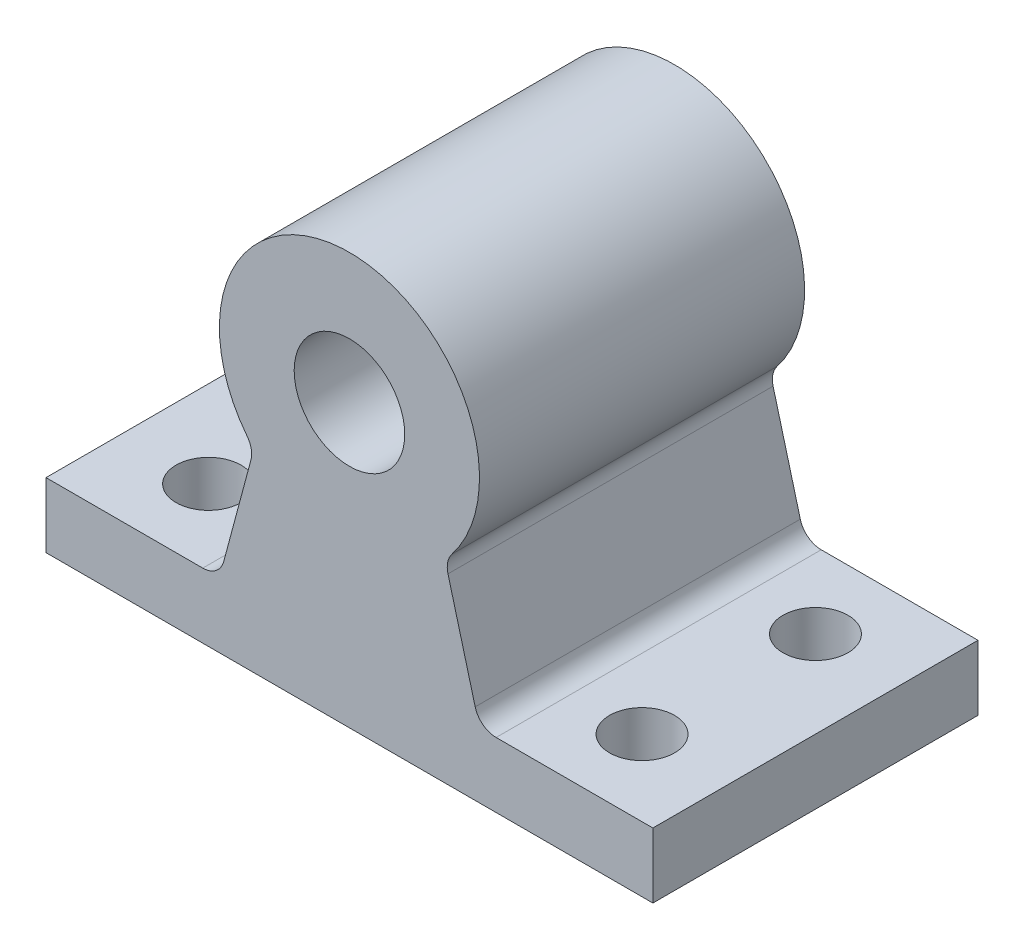
ISO-10303-21;
HEADER;
FILE_DESCRIPTION(('STEP AP214'),'2;1');
FILE_NAME('part.step','',(''),(''),'','','');
FILE_SCHEMA(('AUTOMOTIVE_DESIGN { 1 0 10303 214 1 1 1 1 }'));
ENDSEC;
DATA;
#1=APPLICATION_CONTEXT('core data for automotive mechanical design processes');
#2=APPLICATION_PROTOCOL_DEFINITION('international standard','automotive_design',2000,#1);
#3=PRODUCT_CONTEXT('',#1,'mechanical');
#4=PRODUCT('Part','Part','',(#3));
#5=PRODUCT_RELATED_PRODUCT_CATEGORY('part','',(#4));
#6=PRODUCT_DEFINITION_FORMATION('','',#4);
#7=PRODUCT_DEFINITION_CONTEXT('part definition',#1,'design');
#8=PRODUCT_DEFINITION('design','',#6,#7);
#9=PRODUCT_DEFINITION_SHAPE('','',#8);
#10=(LENGTH_UNIT() NAMED_UNIT(*) SI_UNIT(.MILLI.,.METRE.));
#11=(NAMED_UNIT(*) PLANE_ANGLE_UNIT() SI_UNIT($,.RADIAN.));
#12=(NAMED_UNIT(*) SI_UNIT($,.STERADIAN.) SOLID_ANGLE_UNIT());
#13=UNCERTAINTY_MEASURE_WITH_UNIT(LENGTH_MEASURE(1.E-05),#10,'distance_accuracy_value','');
#14=(GEOMETRIC_REPRESENTATION_CONTEXT(3) GLOBAL_UNCERTAINTY_ASSIGNED_CONTEXT((#13)) GLOBAL_UNIT_ASSIGNED_CONTEXT((#10,
#11,#12)) REPRESENTATION_CONTEXT('',''));
#15=CARTESIAN_POINT('',(0.,0.,0.));
#16=DIRECTION('',(0.,0.,1.));
#17=DIRECTION('',(1.,0.,0.));
#18=AXIS2_PLACEMENT_3D('',#15,#16,#17);
#19=CARTESIAN_POINT('',(0.,13.,7.5));
#20=DIRECTION('',(0.,0.,-1.));
#21=DIRECTION('',(-1.,0.,0.));
#22=AXIS2_PLACEMENT_3D('',#19,#20,#21);
#23=CYLINDRICAL_SURFACE('',#22,2.55);
#24=CARTESIAN_POINT('',(0.,13.,7.5));
#25=DIRECTION('',(0.,0.,1.));
#26=DIRECTION('',(1.,0.,0.));
#27=AXIS2_PLACEMENT_3D('',#24,#25,#26);
#28=CIRCLE('',#27,2.55);
#29=CARTESIAN_POINT('',(2.55,13.,7.5));
#30=VERTEX_POINT('',#29);
#31=EDGE_CURVE('E257',#30,#30,#28,.T.);
#32=ORIENTED_EDGE('',*,*,#31,.T.);
#33=EDGE_LOOP('',(#32));
#34=FACE_BOUND('',#33,.T.);
#35=CARTESIAN_POINT('',(0.,13.,2.));
#36=DIRECTION('',(0.,0.,-1.));
#37=DIRECTION('',(-1.,0.,0.));
#38=AXIS2_PLACEMENT_3D('',#35,#36,#37);
#39=CIRCLE('',#38,2.55);
#40=CARTESIAN_POINT('',(-2.55,13.,2.));
#41=VERTEX_POINT('',#40);
#42=EDGE_CURVE('E271',#41,#41,#39,.T.);
#43=ORIENTED_EDGE('',*,*,#42,.T.);
#44=EDGE_LOOP('',(#43));
#45=FACE_BOUND('',#44,.T.);
#46=ADVANCED_FACE('F37',(#34,#45),#23,.F.);
#47=CARTESIAN_POINT('',(0.,13.,7.5));
#48=DIRECTION('',(0.,0.,-1.));
#49=DIRECTION('',(-1.,0.,0.));
#50=AXIS2_PLACEMENT_3D('',#47,#48,#49);
#51=CYLINDRICAL_SURFACE('',#50,6.);
#52=CARTESIAN_POINT('',(0.,13.,7.5));
#53=DIRECTION('',(0.,0.,1.));
#54=DIRECTION('',(1.,0.,0.));
#55=AXIS2_PLACEMENT_3D('',#52,#53,#54);
#56=CIRCLE('',#55,6.);
#57=CARTESIAN_POINT('',(4.7245347205779,9.30151765259669,7.5));
#58=VERTEX_POINT('',#57);
#59=CARTESIAN_POINT('',(-4.7245347205779,9.30151765259669,7.5));
#60=VERTEX_POINT('',#59);
#61=EDGE_CURVE('E424',#58,#60,#56,.T.);
#62=ORIENTED_EDGE('',*,*,#61,.F.);
#63=DIRECTION('',(0.,0.,-1.));
#64=VECTOR('',#63,1.);
#65=CARTESIAN_POINT('',(4.72453472057791,9.30151765259669,7.5));
#66=LINE('',#65,#64);
#67=CARTESIAN_POINT('',(4.7245347205779,9.30151765259669,-7.5));
#68=VERTEX_POINT('',#67);
#69=EDGE_CURVE('E319',#58,#68,#66,.T.);
#70=ORIENTED_EDGE('',*,*,#69,.T.);
#71=CARTESIAN_POINT('',(0.,13.,-7.5));
#72=DIRECTION('',(0.,0.,1.));
#73=DIRECTION('',(1.,0.,0.));
#74=AXIS2_PLACEMENT_3D('',#71,#72,#73);
#75=CIRCLE('',#74,6.);
#76=CARTESIAN_POINT('',(-4.7245347205779,9.30151765259669,-7.5));
#77=VERTEX_POINT('',#76);
#78=EDGE_CURVE('E237',#68,#77,#75,.T.);
#79=ORIENTED_EDGE('',*,*,#78,.T.);
#80=DIRECTION('',(0.,0.,-1.));
#81=VECTOR('',#80,1.);
#82=CARTESIAN_POINT('',(-4.7245347205779,9.30151765259669,7.5));
#83=LINE('',#82,#81);
#84=EDGE_CURVE('E317',#77,#60,#83,.F.);
#85=ORIENTED_EDGE('',*,*,#84,.T.);
#86=EDGE_LOOP('',(#62,#70,#79,#85));
#87=FACE_BOUND('',#86,.T.);
#88=ADVANCED_FACE('F378',(#87),#51,.T.);
#89=CARTESIAN_POINT('',(-6.34807621135331,1.70096189432337,7.5));
#90=DIRECTION('',(0.965925826289067,-0.258819045102525,0.));
#91=DIRECTION('',(0.258819045102525,0.965925826289067,0.));
#92=AXIS2_PLACEMENT_3D('',#89,#90,#91);
#93=PLANE('',#92);
#94=DIRECTION('',(-0.258819045102525,-0.965925826289067,0.));
#95=VECTOR('',#94,1.);
#96=CARTESIAN_POINT('',(-6.34807621135331,1.70096189432337,7.5));
#97=LINE('',#96,#95);
#98=CARTESIAN_POINT('',(-4.54603134771849,8.42628488292695,7.5));
#99=VERTEX_POINT('',#98);
#100=CARTESIAN_POINT('',(-5.80140116168989,3.74118095489748,7.5));
#101=VERTEX_POINT('',#100);
#102=EDGE_CURVE('E208',#99,#101,#97,.T.);
#103=ORIENTED_EDGE('',*,*,#102,.F.);
#104=DIRECTION('',(0.,0.,1.));
#105=VECTOR('',#104,1.);
#106=CARTESIAN_POINT('',(-4.54603134771849,8.42628488292695,-7.5));
#107=LINE('',#106,#105);
#108=CARTESIAN_POINT('',(-4.54603134771849,8.42628488292695,-7.5));
#109=VERTEX_POINT('',#108);
#110=EDGE_CURVE('E329',#99,#109,#107,.F.);
#111=ORIENTED_EDGE('',*,*,#110,.T.);
#112=DIRECTION('',(-0.258819045102525,-0.965925826289067,0.));
#113=VECTOR('',#112,1.);
#114=CARTESIAN_POINT('',(-6.34807621135331,1.70096189432337,-7.5));
#115=LINE('',#114,#113);
#116=CARTESIAN_POINT('',(-5.80140116168989,3.74118095489748,-7.5));
#117=VERTEX_POINT('',#116);
#118=EDGE_CURVE('E240',#109,#117,#115,.T.);
#119=ORIENTED_EDGE('',*,*,#118,.T.);
#120=DIRECTION('',(0.,0.,-1.));
#121=VECTOR('',#120,1.);
#122=CARTESIAN_POINT('',(-5.80140116168989,3.74118095489748,7.5));
#123=LINE('',#122,#121);
#124=EDGE_CURVE('E327',#117,#101,#123,.F.);
#125=ORIENTED_EDGE('',*,*,#124,.T.);
#126=EDGE_LOOP('',(#103,#111,#119,#125));
#127=FACE_BOUND('',#126,.T.);
#128=ADVANCED_FACE('F364',(#127),#93,.F.);
#129=CARTESIAN_POINT('',(0.,3.,7.5));
#130=DIRECTION('',(0.,-1.,0.));
#131=DIRECTION('',(1.,0.,0.));
#132=AXIS2_PLACEMENT_3D('',#129,#130,#131);
#133=PLANE('',#132);
#134=CARTESIAN_POINT('',(-10.,3.,-4.));
#135=DIRECTION('',(0.,-1.,0.));
#136=DIRECTION('',(1.,0.,0.));
#137=AXIS2_PLACEMENT_3D('',#134,#135,#136);
#138=CIRCLE('',#137,1.5);
#139=CARTESIAN_POINT('',(-8.5,3.,-4.));
#140=VERTEX_POINT('',#139);
#141=EDGE_CURVE('E241',#140,#140,#138,.T.);
#142=ORIENTED_EDGE('',*,*,#141,.T.);
#143=EDGE_LOOP('',(#142));
#144=FACE_BOUND('',#143,.T.);
#145=CARTESIAN_POINT('',(-10.,3.,4.));
#146=DIRECTION('',(0.,-1.,0.));
#147=DIRECTION('',(1.,0.,0.));
#148=AXIS2_PLACEMENT_3D('',#145,#146,#147);
#149=CIRCLE('',#148,1.5);
#150=CARTESIAN_POINT('',(-8.5,3.,4.));
#151=VERTEX_POINT('',#150);
#152=EDGE_CURVE('E270',#151,#151,#149,.T.);
#153=ORIENTED_EDGE('',*,*,#152,.T.);
#154=EDGE_LOOP('',(#153));
#155=FACE_BOUND('',#154,.T.);
#156=DIRECTION('',(-1.,0.,0.));
#157=VECTOR('',#156,1.);
#158=CARTESIAN_POINT('',(0.,3.,7.5));
#159=LINE('',#158,#157);
#160=CARTESIAN_POINT('',(-6.76732698797896,3.,7.5));
#161=VERTEX_POINT('',#160);
#162=CARTESIAN_POINT('',(-14.,3.,7.5));
#163=VERTEX_POINT('',#162);
#164=EDGE_CURVE('E195',#161,#163,#159,.T.);
#165=ORIENTED_EDGE('',*,*,#164,.F.);
#166=DIRECTION('',(0.,0.,-1.));
#167=VECTOR('',#166,1.);
#168=CARTESIAN_POINT('',(-6.76732698797896,3.,-7.5));
#169=LINE('',#168,#167);
#170=CARTESIAN_POINT('',(-6.76732698797896,3.,-7.5));
#171=VERTEX_POINT('',#170);
#172=EDGE_CURVE('E332',#161,#171,#169,.T.);
#173=ORIENTED_EDGE('',*,*,#172,.T.);
#174=DIRECTION('',(-1.,0.,0.));
#175=VECTOR('',#174,1.);
#176=CARTESIAN_POINT('',(0.,3.,-7.5));
#177=LINE('',#176,#175);
#178=CARTESIAN_POINT('',(-14.,3.,-7.5));
#179=VERTEX_POINT('',#178);
#180=EDGE_CURVE('E214',#171,#179,#177,.T.);
#181=ORIENTED_EDGE('',*,*,#180,.T.);
#182=DIRECTION('',(0.,0.,-1.));
#183=VECTOR('',#182,1.);
#184=CARTESIAN_POINT('',(-14.,3.,7.5));
#185=LINE('',#184,#183);
#186=EDGE_CURVE('E211',#163,#179,#185,.T.);
#187=ORIENTED_EDGE('',*,*,#186,.F.);
#188=EDGE_LOOP('',(#165,#173,#181,#187));
#189=FACE_BOUND('',#188,.T.);
#190=ADVANCED_FACE('F212',(#144,#155,#189),#133,.F.);
#191=CARTESIAN_POINT('',(-14.,0.,7.5));
#192=DIRECTION('',(1.,0.,0.));
#193=DIRECTION('',(0.,1.,0.));
#194=AXIS2_PLACEMENT_3D('',#191,#192,#193);
#195=PLANE('',#194);
#196=DIRECTION('',(0.,-1.,0.));
#197=VECTOR('',#196,1.);
#198=CARTESIAN_POINT('',(-14.,0.,-7.5));
#199=LINE('',#198,#197);
#200=CARTESIAN_POINT('',(-14.,0.,-7.5));
#201=VERTEX_POINT('',#200);
#202=EDGE_CURVE('E245',#179,#201,#199,.T.);
#203=ORIENTED_EDGE('',*,*,#202,.T.);
#204=DIRECTION('',(0.,0.,-1.));
#205=VECTOR('',#204,1.);
#206=CARTESIAN_POINT('',(-14.,0.,7.5));
#207=LINE('',#206,#205);
#208=CARTESIAN_POINT('',(-14.,0.,7.5));
#209=VERTEX_POINT('',#208);
#210=EDGE_CURVE('E218',#209,#201,#207,.T.);
#211=ORIENTED_EDGE('',*,*,#210,.F.);
#212=DIRECTION('',(0.,-1.,0.));
#213=VECTOR('',#212,1.);
#214=CARTESIAN_POINT('',(-14.,0.,7.5));
#215=LINE('',#214,#213);
#216=EDGE_CURVE('E200',#163,#209,#215,.T.);
#217=ORIENTED_EDGE('',*,*,#216,.F.);
#218=ORIENTED_EDGE('',*,*,#186,.T.);
#219=EDGE_LOOP('',(#203,#211,#217,#218));
#220=FACE_BOUND('',#219,.T.);
#221=ADVANCED_FACE('F220',(#220),#195,.F.);
#222=CARTESIAN_POINT('',(0.,0.,7.5));
#223=DIRECTION('',(0.,1.,0.));
#224=DIRECTION('',(-1.,0.,0.));
#225=AXIS2_PLACEMENT_3D('',#222,#223,#224);
#226=PLANE('',#225);
#227=CARTESIAN_POINT('',(10.,0.,4.));
#228=DIRECTION('',(0.,-1.,0.));
#229=DIRECTION('',(-1.,0.,0.));
#230=AXIS2_PLACEMENT_3D('',#227,#228,#229);
#231=CIRCLE('',#230,1.5);
#232=CARTESIAN_POINT('',(8.5,0.,4.));
#233=VERTEX_POINT('',#232);
#234=EDGE_CURVE('E274',#233,#233,#231,.T.);
#235=ORIENTED_EDGE('',*,*,#234,.F.);
#236=EDGE_LOOP('',(#235));
#237=FACE_BOUND('',#236,.T.);
#238=CARTESIAN_POINT('',(10.,0.,-4.));
#239=DIRECTION('',(0.,-1.,0.));
#240=DIRECTION('',(1.,0.,0.));
#241=AXIS2_PLACEMENT_3D('',#238,#239,#240);
#242=CIRCLE('',#241,1.5);
#243=CARTESIAN_POINT('',(11.5,0.,-4.));
#244=VERTEX_POINT('',#243);
#245=EDGE_CURVE('E439',#244,#244,#242,.T.);
#246=ORIENTED_EDGE('',*,*,#245,.F.);
#247=EDGE_LOOP('',(#246));
#248=FACE_BOUND('',#247,.T.);
#249=CARTESIAN_POINT('',(-10.,0.,-4.));
#250=DIRECTION('',(0.,-1.,0.));
#251=DIRECTION('',(-1.,0.,0.));
#252=AXIS2_PLACEMENT_3D('',#249,#250,#251);
#253=CIRCLE('',#252,1.5);
#254=CARTESIAN_POINT('',(-11.5,0.,-4.));
#255=VERTEX_POINT('',#254);
#256=EDGE_CURVE('E436',#255,#255,#253,.T.);
#257=ORIENTED_EDGE('',*,*,#256,.F.);
#258=EDGE_LOOP('',(#257));
#259=FACE_BOUND('',#258,.T.);
#260=CARTESIAN_POINT('',(-10.,0.,4.));
#261=DIRECTION('',(0.,-1.,0.));
#262=DIRECTION('',(1.,0.,0.));
#263=AXIS2_PLACEMENT_3D('',#260,#261,#262);
#264=CIRCLE('',#263,1.5);
#265=CARTESIAN_POINT('',(-8.5,0.,4.));
#266=VERTEX_POINT('',#265);
#267=EDGE_CURVE('E267',#266,#266,#264,.T.);
#268=ORIENTED_EDGE('',*,*,#267,.F.);
#269=EDGE_LOOP('',(#268));
#270=FACE_BOUND('',#269,.T.);
#271=DIRECTION('',(1.,0.,0.));
#272=VECTOR('',#271,1.);
#273=CARTESIAN_POINT('',(0.,0.,-7.5));
#274=LINE('',#273,#272);
#275=CARTESIAN_POINT('',(14.,0.,-7.5));
#276=VERTEX_POINT('',#275);
#277=EDGE_CURVE('E247',#201,#276,#274,.T.);
#278=ORIENTED_EDGE('',*,*,#277,.T.);
#279=DIRECTION('',(0.,0.,-1.));
#280=VECTOR('',#279,1.);
#281=CARTESIAN_POINT('',(14.,0.,7.5));
#282=LINE('',#281,#280);
#283=CARTESIAN_POINT('',(14.,0.,7.5));
#284=VERTEX_POINT('',#283);
#285=EDGE_CURVE('E260',#284,#276,#282,.T.);
#286=ORIENTED_EDGE('',*,*,#285,.F.);
#287=DIRECTION('',(1.,0.,0.));
#288=VECTOR('',#287,1.);
#289=CARTESIAN_POINT('',(0.,0.,7.5));
#290=LINE('',#289,#288);
#291=EDGE_CURVE('E223',#209,#284,#290,.T.);
#292=ORIENTED_EDGE('',*,*,#291,.F.);
#293=ORIENTED_EDGE('',*,*,#210,.T.);
#294=EDGE_LOOP('',(#278,#286,#292,#293));
#295=FACE_BOUND('',#294,.T.);
#296=ADVANCED_FACE('F563',(#237,#248,#259,#270,#295),#226,.F.);
#297=CARTESIAN_POINT('',(14.,0.,7.5));
#298=DIRECTION('',(1.,0.,0.));
#299=DIRECTION('',(0.,1.,0.));
#300=AXIS2_PLACEMENT_3D('',#297,#298,#299);
#301=PLANE('',#300);
#302=DIRECTION('',(0.,-1.,0.));
#303=VECTOR('',#302,1.);
#304=CARTESIAN_POINT('',(14.,0.,-7.5));
#305=LINE('',#304,#303);
#306=CARTESIAN_POINT('',(14.,3.,-7.5));
#307=VERTEX_POINT('',#306);
#308=EDGE_CURVE('E250',#307,#276,#305,.T.);
#309=ORIENTED_EDGE('',*,*,#308,.F.);
#310=DIRECTION('',(0.,0.,-1.));
#311=VECTOR('',#310,1.);
#312=CARTESIAN_POINT('',(14.,3.,7.5));
#313=LINE('',#312,#311);
#314=CARTESIAN_POINT('',(14.,3.,7.5));
#315=VERTEX_POINT('',#314);
#316=EDGE_CURVE('E236',#315,#307,#313,.T.);
#317=ORIENTED_EDGE('',*,*,#316,.F.);
#318=DIRECTION('',(0.,-1.,0.));
#319=VECTOR('',#318,1.);
#320=CARTESIAN_POINT('',(14.,0.,7.5));
#321=LINE('',#320,#319);
#322=EDGE_CURVE('E225',#315,#284,#321,.T.);
#323=ORIENTED_EDGE('',*,*,#322,.T.);
#324=ORIENTED_EDGE('',*,*,#285,.T.);
#325=EDGE_LOOP('',(#309,#317,#323,#324));
#326=FACE_BOUND('',#325,.T.);
#327=ADVANCED_FACE('F559',(#326),#301,.T.);
#328=CARTESIAN_POINT('',(0.,3.,7.5));
#329=DIRECTION('',(0.,1.,0.));
#330=DIRECTION('',(-1.,0.,0.));
#331=AXIS2_PLACEMENT_3D('',#328,#329,#330);
#332=PLANE('',#331);
#333=CARTESIAN_POINT('',(10.,3.,4.));
#334=DIRECTION('',(0.,1.,0.));
#335=DIRECTION('',(-1.,0.,0.));
#336=AXIS2_PLACEMENT_3D('',#333,#334,#335);
#337=CIRCLE('',#336,1.5);
#338=CARTESIAN_POINT('',(8.5,3.,4.));
#339=VERTEX_POINT('',#338);
#340=EDGE_CURVE('E266',#339,#339,#337,.T.);
#341=ORIENTED_EDGE('',*,*,#340,.F.);
#342=EDGE_LOOP('',(#341));
#343=FACE_BOUND('',#342,.T.);
#344=CARTESIAN_POINT('',(10.,3.,-4.));
#345=DIRECTION('',(0.,1.,0.));
#346=DIRECTION('',(-1.,0.,0.));
#347=AXIS2_PLACEMENT_3D('',#344,#345,#346);
#348=CIRCLE('',#347,1.5);
#349=CARTESIAN_POINT('',(8.5,3.,-4.));
#350=VERTEX_POINT('',#349);
#351=EDGE_CURVE('E263',#350,#350,#348,.T.);
#352=ORIENTED_EDGE('',*,*,#351,.F.);
#353=EDGE_LOOP('',(#352));
#354=FACE_BOUND('',#353,.T.);
#355=DIRECTION('',(1.,0.,0.));
#356=VECTOR('',#355,1.);
#357=CARTESIAN_POINT('',(0.,3.,-7.5));
#358=LINE('',#357,#356);
#359=CARTESIAN_POINT('',(6.76732698797896,3.,-7.5));
#360=VERTEX_POINT('',#359);
#361=EDGE_CURVE('E253',#360,#307,#358,.T.);
#362=ORIENTED_EDGE('',*,*,#361,.F.);
#363=DIRECTION('',(0.,0.,-1.));
#364=VECTOR('',#363,1.);
#365=CARTESIAN_POINT('',(6.76732698797896,3.,7.5));
#366=LINE('',#365,#364);
#367=CARTESIAN_POINT('',(6.76732698797896,3.,7.5));
#368=VERTEX_POINT('',#367);
#369=EDGE_CURVE('E52',#360,#368,#366,.F.);
#370=ORIENTED_EDGE('',*,*,#369,.T.);
#371=DIRECTION('',(1.,0.,0.));
#372=VECTOR('',#371,1.);
#373=CARTESIAN_POINT('',(0.,3.,7.5));
#374=LINE('',#373,#372);
#375=EDGE_CURVE('E231',#368,#315,#374,.T.);
#376=ORIENTED_EDGE('',*,*,#375,.T.);
#377=ORIENTED_EDGE('',*,*,#316,.T.);
#378=EDGE_LOOP('',(#362,#370,#376,#377));
#379=FACE_BOUND('',#378,.T.);
#380=ADVANCED_FACE('F555',(#343,#354,#379),#332,.T.);
#381=CARTESIAN_POINT('',(6.34807621135332,1.70096189432337,7.5));
#382=DIRECTION('',(0.965925826289067,0.258819045102525,0.));
#383=DIRECTION('',(-0.258819045102525,0.965925826289067,0.));
#384=AXIS2_PLACEMENT_3D('',#381,#382,#383);
#385=PLANE('',#384);
#386=DIRECTION('',(0.258819045102525,-0.965925826289067,0.));
#387=VECTOR('',#386,1.);
#388=CARTESIAN_POINT('',(6.34807621135332,1.70096189432337,-7.5));
#389=LINE('',#388,#387);
#390=CARTESIAN_POINT('',(4.54603134771849,8.42628488292696,-7.5));
#391=VERTEX_POINT('',#390);
#392=CARTESIAN_POINT('',(5.80140116168989,3.74118095489748,-7.5));
#393=VERTEX_POINT('',#392);
#394=EDGE_CURVE('E255',#391,#393,#389,.T.);
#395=ORIENTED_EDGE('',*,*,#394,.F.);
#396=DIRECTION('',(0.,0.,-1.));
#397=VECTOR('',#396,1.);
#398=CARTESIAN_POINT('',(4.54603134771849,8.42628488292695,7.5));
#399=LINE('',#398,#397);
#400=CARTESIAN_POINT('',(4.54603134771849,8.42628488292696,7.5));
#401=VERTEX_POINT('',#400);
#402=EDGE_CURVE('E325',#391,#401,#399,.F.);
#403=ORIENTED_EDGE('',*,*,#402,.T.);
#404=DIRECTION('',(0.258819045102525,-0.965925826289067,0.));
#405=VECTOR('',#404,1.);
#406=CARTESIAN_POINT('',(6.34807621135332,1.70096189432337,7.5));
#407=LINE('',#406,#405);
#408=CARTESIAN_POINT('',(5.80140116168989,3.74118095489748,7.5));
#409=VERTEX_POINT('',#408);
#410=EDGE_CURVE('E233',#401,#409,#407,.T.);
#411=ORIENTED_EDGE('',*,*,#410,.T.);
#412=DIRECTION('',(0.,0.,-1.));
#413=VECTOR('',#412,1.);
#414=CARTESIAN_POINT('',(5.80140116168989,3.74118095489748,-7.5));
#415=LINE('',#414,#413);
#416=EDGE_CURVE('E322',#409,#393,#415,.T.);
#417=ORIENTED_EDGE('',*,*,#416,.T.);
#418=EDGE_LOOP('',(#395,#403,#411,#417));
#419=FACE_BOUND('',#418,.T.);
#420=ADVANCED_FACE('F549',(#419),#385,.T.);
#421=CARTESIAN_POINT('',(0.,0.,7.5));
#422=DIRECTION('',(0.,0.,1.));
#423=DIRECTION('',(1.,0.,0.));
#424=AXIS2_PLACEMENT_3D('',#421,#422,#423);
#425=PLANE('',#424);
#426=ORIENTED_EDGE('',*,*,#31,.F.);
#427=EDGE_LOOP('',(#426));
#428=FACE_BOUND('',#427,.T.);
#429=ORIENTED_EDGE('',*,*,#410,.F.);
#430=CARTESIAN_POINT('',(5.51195717400756,8.68510392802948,7.5));
#431=DIRECTION('',(0.,0.,1.));
#432=DIRECTION('',(1.,0.,0.));
#433=AXIS2_PLACEMENT_3D('',#430,#431,#432);
#434=CIRCLE('',#433,1.);
#435=EDGE_CURVE('E349',#401,#58,#434,.F.);
#436=ORIENTED_EDGE('',*,*,#435,.T.);
#437=ORIENTED_EDGE('',*,*,#61,.T.);
#438=CARTESIAN_POINT('',(-5.51195717400755,8.68510392802948,7.5));
#439=DIRECTION('',(0.,0.,1.));
#440=DIRECTION('',(1.,0.,0.));
#441=AXIS2_PLACEMENT_3D('',#438,#439,#440);
#442=CIRCLE('',#441,1.);
#443=EDGE_CURVE('E353',#60,#99,#442,.F.);
#444=ORIENTED_EDGE('',*,*,#443,.T.);
#445=ORIENTED_EDGE('',*,*,#102,.T.);
#446=CARTESIAN_POINT('',(-6.76732698797896,4.,7.5));
#447=DIRECTION('',(0.,0.,1.));
#448=DIRECTION('',(1.,0.,0.));
#449=AXIS2_PLACEMENT_3D('',#446,#447,#448);
#450=CIRCLE('',#449,1.);
#451=EDGE_CURVE('E204',#101,#161,#450,.F.);
#452=ORIENTED_EDGE('',*,*,#451,.T.);
#453=ORIENTED_EDGE('',*,*,#164,.T.);
#454=ORIENTED_EDGE('',*,*,#216,.T.);
#455=ORIENTED_EDGE('',*,*,#291,.T.);
#456=ORIENTED_EDGE('',*,*,#322,.F.);
#457=ORIENTED_EDGE('',*,*,#375,.F.);
#458=CARTESIAN_POINT('',(6.76732698797896,4.,7.5));
#459=DIRECTION('',(0.,0.,1.));
#460=DIRECTION('',(1.,0.,0.));
#461=AXIS2_PLACEMENT_3D('',#458,#459,#460);
#462=CIRCLE('',#461,1.);
#463=EDGE_CURVE('E11',#368,#409,#462,.F.);
#464=ORIENTED_EDGE('',*,*,#463,.T.);
#465=EDGE_LOOP('',(#429,#436,#437,#444,#445,#452,#453,#454,#455,#456,#457,#464));
#466=FACE_BOUND('',#465,.T.);
#467=ADVANCED_FACE('F198',(#428,#466),#425,.T.);
#468=CARTESIAN_POINT('',(0.,0.,-7.5));
#469=DIRECTION('',(0.,0.,1.));
#470=DIRECTION('',(1.,0.,0.));
#471=AXIS2_PLACEMENT_3D('',#468,#469,#470);
#472=PLANE('',#471);
#473=DIRECTION('',(-0.866025403784439,0.5,0.));
#474=VECTOR('',#473,1.);
#475=CARTESIAN_POINT('',(0.,8.15025773880714,-7.5));
#476=LINE('',#475,#474);
#477=CARTESIAN_POINT('',(-0.5,8.43893287340196,-7.5));
#478=VERTEX_POINT('',#477);
#479=CARTESIAN_POINT('',(-3.7,10.2864537348088,-7.5));
#480=VERTEX_POINT('',#479);
#481=EDGE_CURVE('E457',#478,#480,#476,.T.);
#482=ORIENTED_EDGE('',*,*,#481,.F.);
#483=CARTESIAN_POINT('',(0.,9.3049582771864,-7.5));
#484=DIRECTION('',(0.,0.,1.));
#485=DIRECTION('',(1.,0.,0.));
#486=AXIS2_PLACEMENT_3D('',#483,#484,#485);
#487=CIRCLE('',#486,1.);
#488=CARTESIAN_POINT('',(0.500000000000001,8.43893287340196,-7.5));
#489=VERTEX_POINT('',#488);
#490=EDGE_CURVE('E343',#478,#489,#487,.T.);
#491=ORIENTED_EDGE('',*,*,#490,.T.);
#492=DIRECTION('',(-0.866025403784438,-0.5,0.));
#493=VECTOR('',#492,1.);
#494=CARTESIAN_POINT('',(4.20000000000001,10.5751288694036,-7.5));
#495=LINE('',#494,#493);
#496=CARTESIAN_POINT('',(3.70000000000001,10.2864537348088,-7.5));
#497=VERTEX_POINT('',#496);
#498=EDGE_CURVE('E460',#497,#489,#495,.T.);
#499=ORIENTED_EDGE('',*,*,#498,.F.);
#500=CARTESIAN_POINT('',(3.20000000000001,11.1524791385932,-7.5));
#501=DIRECTION('',(0.,0.,1.));
#502=DIRECTION('',(1.,0.,0.));
#503=AXIS2_PLACEMENT_3D('',#500,#501,#502);
#504=CIRCLE('',#503,1.);
#505=CARTESIAN_POINT('',(4.20000000000001,11.1524791385932,-7.5));
#506=VERTEX_POINT('',#505);
#507=EDGE_CURVE('E335',#497,#506,#504,.T.);
#508=ORIENTED_EDGE('',*,*,#507,.T.);
#509=DIRECTION('',(0.,-1.,0.));
#510=VECTOR('',#509,1.);
#511=CARTESIAN_POINT('',(4.2,15.4248711305964,-7.5));
#512=LINE('',#511,#510);
#513=CARTESIAN_POINT('',(4.2,14.8475208614068,-7.5));
#514=VERTEX_POINT('',#513);
#515=EDGE_CURVE('E444',#514,#506,#512,.T.);
#516=ORIENTED_EDGE('',*,*,#515,.F.);
#517=CARTESIAN_POINT('',(3.2,14.8475208614068,-7.5));
#518=DIRECTION('',(0.,0.,1.));
#519=DIRECTION('',(1.,0.,0.));
#520=AXIS2_PLACEMENT_3D('',#517,#518,#519);
#521=CIRCLE('',#520,1.);
#522=CARTESIAN_POINT('',(3.7,15.7135462651912,-7.5));
#523=VERTEX_POINT('',#522);
#524=EDGE_CURVE('E337',#514,#523,#521,.T.);
#525=ORIENTED_EDGE('',*,*,#524,.T.);
#526=DIRECTION('',(0.866025403784439,-0.499999999999999,0.));
#527=VECTOR('',#526,1.);
#528=CARTESIAN_POINT('',(0.,17.8497422611929,-7.5));
#529=LINE('',#528,#527);
#530=CARTESIAN_POINT('',(0.500000000000001,17.561067126598,-7.5));
#531=VERTEX_POINT('',#530);
#532=EDGE_CURVE('E448',#531,#523,#529,.T.);
#533=ORIENTED_EDGE('',*,*,#532,.F.);
#534=CARTESIAN_POINT('',(0.,16.6950417228136,-7.5));
#535=DIRECTION('',(0.,0.,1.));
#536=DIRECTION('',(1.,0.,0.));
#537=AXIS2_PLACEMENT_3D('',#534,#535,#536);
#538=CIRCLE('',#537,1.);
#539=CARTESIAN_POINT('',(-0.5,17.561067126598,-7.5));
#540=VERTEX_POINT('',#539);
#541=EDGE_CURVE('E345',#531,#540,#538,.T.);
#542=ORIENTED_EDGE('',*,*,#541,.T.);
#543=DIRECTION('',(0.866025403784438,0.5,0.));
#544=VECTOR('',#543,1.);
#545=CARTESIAN_POINT('',(-4.2,15.4248711305964,-7.5));
#546=LINE('',#545,#544);
#547=CARTESIAN_POINT('',(-3.7,15.7135462651912,-7.5));
#548=VERTEX_POINT('',#547);
#549=EDGE_CURVE('E451',#548,#540,#546,.T.);
#550=ORIENTED_EDGE('',*,*,#549,.F.);
#551=CARTESIAN_POINT('',(-3.2,14.8475208614068,-7.5));
#552=DIRECTION('',(0.,0.,1.));
#553=DIRECTION('',(1.,0.,0.));
#554=AXIS2_PLACEMENT_3D('',#551,#552,#553);
#555=CIRCLE('',#554,1.);
#556=CARTESIAN_POINT('',(-4.2,14.8475208614068,-7.5));
#557=VERTEX_POINT('',#556);
#558=EDGE_CURVE('E339',#548,#557,#555,.T.);
#559=ORIENTED_EDGE('',*,*,#558,.T.);
#560=DIRECTION('',(0.,1.,0.));
#561=VECTOR('',#560,1.);
#562=CARTESIAN_POINT('',(-4.2,10.5751288694036,-7.5));
#563=LINE('',#562,#561);
#564=CARTESIAN_POINT('',(-4.2,11.1524791385932,-7.5));
#565=VERTEX_POINT('',#564);
#566=EDGE_CURVE('E454',#565,#557,#563,.T.);
#567=ORIENTED_EDGE('',*,*,#566,.F.);
#568=CARTESIAN_POINT('',(-3.2,11.1524791385932,-7.5));
#569=DIRECTION('',(0.,0.,1.));
#570=DIRECTION('',(1.,0.,0.));
#571=AXIS2_PLACEMENT_3D('',#568,#569,#570);
#572=CIRCLE('',#571,1.);
#573=EDGE_CURVE('E341',#565,#480,#572,.T.);
#574=ORIENTED_EDGE('',*,*,#573,.T.);
#575=EDGE_LOOP('',(#482,#491,#499,#508,#516,#525,#533,#542,#550,#559,#567,#574));
#576=FACE_BOUND('',#575,.T.);
#577=ORIENTED_EDGE('',*,*,#78,.F.);
#578=CARTESIAN_POINT('',(5.51195717400756,8.68510392802948,-7.5));
#579=DIRECTION('',(0.,0.,1.));
#580=DIRECTION('',(1.,0.,0.));
#581=AXIS2_PLACEMENT_3D('',#578,#579,#580);
#582=CIRCLE('',#581,1.);
#583=EDGE_CURVE('E347',#68,#391,#582,.T.);
#584=ORIENTED_EDGE('',*,*,#583,.T.);
#585=ORIENTED_EDGE('',*,*,#394,.T.);
#586=CARTESIAN_POINT('',(6.76732698797896,4.,-7.5));
#587=DIRECTION('',(0.,0.,1.));
#588=DIRECTION('',(1.,0.,0.));
#589=AXIS2_PLACEMENT_3D('',#586,#587,#588);
#590=CIRCLE('',#589,1.);
#591=EDGE_CURVE('E45',#393,#360,#590,.T.);
#592=ORIENTED_EDGE('',*,*,#591,.T.);
#593=ORIENTED_EDGE('',*,*,#361,.T.);
#594=ORIENTED_EDGE('',*,*,#308,.T.);
#595=ORIENTED_EDGE('',*,*,#277,.F.);
#596=ORIENTED_EDGE('',*,*,#202,.F.);
#597=ORIENTED_EDGE('',*,*,#180,.F.);
#598=CARTESIAN_POINT('',(-6.76732698797896,4.,-7.5));
#599=DIRECTION('',(0.,0.,1.));
#600=DIRECTION('',(1.,0.,0.));
#601=AXIS2_PLACEMENT_3D('',#598,#599,#600);
#602=CIRCLE('',#601,1.);
#603=EDGE_CURVE('E355',#171,#117,#602,.T.);
#604=ORIENTED_EDGE('',*,*,#603,.T.);
#605=ORIENTED_EDGE('',*,*,#118,.F.);
#606=CARTESIAN_POINT('',(-5.51195717400755,8.68510392802948,-7.5));
#607=DIRECTION('',(0.,0.,1.));
#608=DIRECTION('',(1.,0.,0.));
#609=AXIS2_PLACEMENT_3D('',#606,#607,#608);
#610=CIRCLE('',#609,1.);
#611=EDGE_CURVE('E351',#109,#77,#610,.T.);
#612=ORIENTED_EDGE('',*,*,#611,.T.);
#613=EDGE_LOOP('',(#577,#584,#585,#592,#593,#594,#595,#596,#597,#604,#605,#612));
#614=FACE_BOUND('',#613,.T.);
#615=ADVANCED_FACE('F359',(#576,#614),#472,.F.);
#616=CARTESIAN_POINT('',(10.,19.,-4.));
#617=DIRECTION('',(0.,-1.,0.));
#618=DIRECTION('',(1.,0.,0.));
#619=AXIS2_PLACEMENT_3D('',#616,#617,#618);
#620=CYLINDRICAL_SURFACE('',#619,1.5);
#621=ORIENTED_EDGE('',*,*,#351,.T.);
#622=EDGE_LOOP('',(#621));
#623=FACE_BOUND('',#622,.T.);
#624=ORIENTED_EDGE('',*,*,#245,.T.);
#625=EDGE_LOOP('',(#624));
#626=FACE_BOUND('',#625,.T.);
#627=ADVANCED_FACE('F536',(#623,#626),#620,.F.);
#628=CARTESIAN_POINT('',(10.,19.,4.));
#629=DIRECTION('',(0.,-1.,0.));
#630=DIRECTION('',(1.,0.,0.));
#631=AXIS2_PLACEMENT_3D('',#628,#629,#630);
#632=CYLINDRICAL_SURFACE('',#631,1.5);
#633=ORIENTED_EDGE('',*,*,#340,.T.);
#634=EDGE_LOOP('',(#633));
#635=FACE_BOUND('',#634,.T.);
#636=ORIENTED_EDGE('',*,*,#234,.T.);
#637=EDGE_LOOP('',(#636));
#638=FACE_BOUND('',#637,.T.);
#639=ADVANCED_FACE('F539',(#635,#638),#632,.F.);
#640=CARTESIAN_POINT('',(-10.,19.,4.));
#641=DIRECTION('',(0.,-1.,0.));
#642=DIRECTION('',(1.,0.,0.));
#643=AXIS2_PLACEMENT_3D('',#640,#641,#642);
#644=CYLINDRICAL_SURFACE('',#643,1.5);
#645=ORIENTED_EDGE('',*,*,#267,.T.);
#646=EDGE_LOOP('',(#645));
#647=FACE_BOUND('',#646,.T.);
#648=ORIENTED_EDGE('',*,*,#152,.F.);
#649=EDGE_LOOP('',(#648));
#650=FACE_BOUND('',#649,.T.);
#651=ADVANCED_FACE('F530',(#647,#650),#644,.F.);
#652=CARTESIAN_POINT('',(-10.,19.,-4.));
#653=DIRECTION('',(0.,-1.,0.));
#654=DIRECTION('',(1.,0.,0.));
#655=AXIS2_PLACEMENT_3D('',#652,#653,#654);
#656=CYLINDRICAL_SURFACE('',#655,1.5);
#657=ORIENTED_EDGE('',*,*,#256,.T.);
#658=EDGE_LOOP('',(#657));
#659=FACE_BOUND('',#658,.T.);
#660=ORIENTED_EDGE('',*,*,#141,.F.);
#661=EDGE_LOOP('',(#660));
#662=FACE_BOUND('',#661,.T.);
#663=ADVANCED_FACE('F523',(#659,#662),#656,.F.);
#664=CARTESIAN_POINT('',(4.20000000000001,10.5751288694036,2.));
#665=DIRECTION('',(0.5,-0.866025403784438,0.));
#666=DIRECTION('',(0.866025403784438,0.5,0.));
#667=AXIS2_PLACEMENT_3D('',#664,#665,#666);
#668=PLANE('',#667);
#669=DIRECTION('',(-0.866025403784438,-0.5,0.));
#670=VECTOR('',#669,1.);
#671=CARTESIAN_POINT('',(4.20000000000001,10.5751288694036,2.));
#672=LINE('',#671,#670);
#673=CARTESIAN_POINT('',(3.70000000000001,10.2864537348088,2.));
#674=VERTEX_POINT('',#673);
#675=CARTESIAN_POINT('',(0.500000000000001,8.43893287340196,2.));
#676=VERTEX_POINT('',#675);
#677=EDGE_CURVE('E447',#674,#676,#672,.T.);
#678=ORIENTED_EDGE('',*,*,#677,.F.);
#679=DIRECTION('',(0.,0.,-1.));
#680=VECTOR('',#679,1.);
#681=CARTESIAN_POINT('',(3.70000000000001,10.2864537348088,-7.5));
#682=LINE('',#681,#680);
#683=EDGE_CURVE('E277',#674,#497,#682,.T.);
#684=ORIENTED_EDGE('',*,*,#683,.T.);
#685=ORIENTED_EDGE('',*,*,#498,.T.);
#686=DIRECTION('',(0.,0.,-1.));
#687=VECTOR('',#686,1.);
#688=CARTESIAN_POINT('',(0.500000000000001,8.43893287340196,2.));
#689=LINE('',#688,#687);
#690=EDGE_CURVE('E217',#489,#676,#689,.F.);
#691=ORIENTED_EDGE('',*,*,#690,.T.);
#692=EDGE_LOOP('',(#678,#684,#685,#691));
#693=FACE_BOUND('',#692,.T.);
#694=ADVANCED_FACE('F521',(#693),#668,.F.);
#695=CARTESIAN_POINT('',(4.2,15.4248711305964,2.));
#696=DIRECTION('',(1.,0.,0.));
#697=DIRECTION('',(0.,1.,0.));
#698=AXIS2_PLACEMENT_3D('',#695,#696,#697);
#699=PLANE('',#698);
#700=ORIENTED_EDGE('',*,*,#515,.T.);
#701=DIRECTION('',(0.,0.,-1.));
#702=VECTOR('',#701,1.);
#703=CARTESIAN_POINT('',(4.20000000000001,11.1524791385932,2.));
#704=LINE('',#703,#702);
#705=CARTESIAN_POINT('',(4.20000000000001,11.1524791385932,2.));
#706=VERTEX_POINT('',#705);
#707=EDGE_CURVE('E283',#506,#706,#704,.F.);
#708=ORIENTED_EDGE('',*,*,#707,.T.);
#709=DIRECTION('',(0.,-1.,0.));
#710=VECTOR('',#709,1.);
#711=CARTESIAN_POINT('',(4.2,15.4248711305964,2.));
#712=LINE('',#711,#710);
#713=CARTESIAN_POINT('',(4.2,14.8475208614068,2.));
#714=VERTEX_POINT('',#713);
#715=EDGE_CURVE('E275',#714,#706,#712,.T.);
#716=ORIENTED_EDGE('',*,*,#715,.F.);
#717=DIRECTION('',(0.,0.,-1.));
#718=VECTOR('',#717,1.);
#719=CARTESIAN_POINT('',(4.2,14.8475208614068,-7.5));
#720=LINE('',#719,#718);
#721=EDGE_CURVE('E280',#714,#514,#720,.T.);
#722=ORIENTED_EDGE('',*,*,#721,.T.);
#723=EDGE_LOOP('',(#700,#708,#716,#722));
#724=FACE_BOUND('',#723,.T.);
#725=ADVANCED_FACE('F519',(#724),#699,.F.);
#726=CARTESIAN_POINT('',(0.,17.8497422611929,2.));
#727=DIRECTION('',(0.499999999999999,0.866025403784439,0.));
#728=DIRECTION('',(-0.866025403784439,0.499999999999999,0.));
#729=AXIS2_PLACEMENT_3D('',#726,#727,#728);
#730=PLANE('',#729);
#731=ORIENTED_EDGE('',*,*,#532,.T.);
#732=DIRECTION('',(0.,0.,-1.));
#733=VECTOR('',#732,1.);
#734=CARTESIAN_POINT('',(3.7,15.7135462651912,2.));
#735=LINE('',#734,#733);
#736=CARTESIAN_POINT('',(3.7,15.7135462651912,2.));
#737=VERTEX_POINT('',#736);
#738=EDGE_CURVE('E300',#523,#737,#735,.F.);
#739=ORIENTED_EDGE('',*,*,#738,.T.);
#740=DIRECTION('',(0.866025403784439,-0.499999999999999,0.));
#741=VECTOR('',#740,1.);
#742=CARTESIAN_POINT('',(0.,17.8497422611929,2.));
#743=LINE('',#742,#741);
#744=CARTESIAN_POINT('',(0.500000000000001,17.561067126598,2.));
#745=VERTEX_POINT('',#744);
#746=EDGE_CURVE('E465',#745,#737,#743,.T.);
#747=ORIENTED_EDGE('',*,*,#746,.F.);
#748=DIRECTION('',(0.,0.,-1.));
#749=VECTOR('',#748,1.);
#750=CARTESIAN_POINT('',(0.500000000000001,17.561067126598,-7.5));
#751=LINE('',#750,#749);
#752=EDGE_CURVE('E297',#745,#531,#751,.T.);
#753=ORIENTED_EDGE('',*,*,#752,.T.);
#754=EDGE_LOOP('',(#731,#739,#747,#753));
#755=FACE_BOUND('',#754,.T.);
#756=ADVANCED_FACE('F512',(#755),#730,.F.);
#757=CARTESIAN_POINT('',(-4.2,15.4248711305964,2.));
#758=DIRECTION('',(-0.5,0.866025403784438,0.));
#759=DIRECTION('',(-0.866025403784438,-0.5,0.));
#760=AXIS2_PLACEMENT_3D('',#757,#758,#759);
#761=PLANE('',#760);
#762=DIRECTION('',(0.866025403784438,0.5,0.));
#763=VECTOR('',#762,1.);
#764=CARTESIAN_POINT('',(-4.2,15.4248711305964,2.));
#765=LINE('',#764,#763);
#766=CARTESIAN_POINT('',(-3.7,15.7135462651912,2.));
#767=VERTEX_POINT('',#766);
#768=CARTESIAN_POINT('',(-0.5,17.561067126598,2.));
#769=VERTEX_POINT('',#768);
#770=EDGE_CURVE('E468',#767,#769,#765,.T.);
#771=ORIENTED_EDGE('',*,*,#770,.F.);
#772=DIRECTION('',(0.,0.,-1.));
#773=VECTOR('',#772,1.);
#774=CARTESIAN_POINT('',(-3.7,15.7135462651912,-7.5));
#775=LINE('',#774,#773);
#776=EDGE_CURVE('E304',#767,#548,#775,.T.);
#777=ORIENTED_EDGE('',*,*,#776,.T.);
#778=ORIENTED_EDGE('',*,*,#549,.T.);
#779=DIRECTION('',(0.,0.,-1.));
#780=VECTOR('',#779,1.);
#781=CARTESIAN_POINT('',(-0.5,17.561067126598,2.));
#782=LINE('',#781,#780);
#783=EDGE_CURVE('E302',#540,#769,#782,.F.);
#784=ORIENTED_EDGE('',*,*,#783,.T.);
#785=EDGE_LOOP('',(#771,#777,#778,#784));
#786=FACE_BOUND('',#785,.T.);
#787=ADVANCED_FACE('F505',(#786),#761,.F.);
#788=CARTESIAN_POINT('',(-4.2,10.5751288694036,2.));
#789=DIRECTION('',(-1.,0.,0.));
#790=DIRECTION('',(0.,-1.,0.));
#791=AXIS2_PLACEMENT_3D('',#788,#789,#790);
#792=PLANE('',#791);
#793=ORIENTED_EDGE('',*,*,#566,.T.);
#794=DIRECTION('',(0.,0.,-1.));
#795=VECTOR('',#794,1.);
#796=CARTESIAN_POINT('',(-4.2,14.8475208614068,2.));
#797=LINE('',#796,#795);
#798=CARTESIAN_POINT('',(-4.2,14.8475208614068,2.));
#799=VERTEX_POINT('',#798);
#800=EDGE_CURVE('E310',#557,#799,#797,.F.);
#801=ORIENTED_EDGE('',*,*,#800,.T.);
#802=DIRECTION('',(0.,1.,0.));
#803=VECTOR('',#802,1.);
#804=CARTESIAN_POINT('',(-4.2,10.5751288694036,2.));
#805=LINE('',#804,#803);
#806=CARTESIAN_POINT('',(-4.2,11.1524791385932,2.));
#807=VERTEX_POINT('',#806);
#808=EDGE_CURVE('E471',#807,#799,#805,.T.);
#809=ORIENTED_EDGE('',*,*,#808,.F.);
#810=DIRECTION('',(0.,0.,-1.));
#811=VECTOR('',#810,1.);
#812=CARTESIAN_POINT('',(-4.2,11.1524791385932,-7.5));
#813=LINE('',#812,#811);
#814=EDGE_CURVE('E307',#807,#565,#813,.T.);
#815=ORIENTED_EDGE('',*,*,#814,.T.);
#816=EDGE_LOOP('',(#793,#801,#809,#815));
#817=FACE_BOUND('',#816,.T.);
#818=ADVANCED_FACE('F498',(#817),#792,.F.);
#819=CARTESIAN_POINT('',(0.,8.15025773880714,2.));
#820=DIRECTION('',(-0.5,-0.866025403784439,0.));
#821=DIRECTION('',(0.866025403784439,-0.5,0.));
#822=AXIS2_PLACEMENT_3D('',#819,#820,#821);
#823=PLANE('',#822);
#824=ORIENTED_EDGE('',*,*,#481,.T.);
#825=DIRECTION('',(0.,0.,-1.));
#826=VECTOR('',#825,1.);
#827=CARTESIAN_POINT('',(-3.7,10.2864537348088,2.));
#828=LINE('',#827,#826);
#829=CARTESIAN_POINT('',(-3.7,10.2864537348088,2.));
#830=VERTEX_POINT('',#829);
#831=EDGE_CURVE('E315',#480,#830,#828,.F.);
#832=ORIENTED_EDGE('',*,*,#831,.T.);
#833=DIRECTION('',(-0.866025403784439,0.5,0.));
#834=VECTOR('',#833,1.);
#835=CARTESIAN_POINT('',(0.,8.15025773880714,2.));
#836=LINE('',#835,#834);
#837=CARTESIAN_POINT('',(-0.5,8.43893287340196,2.));
#838=VERTEX_POINT('',#837);
#839=EDGE_CURVE('E474',#838,#830,#836,.T.);
#840=ORIENTED_EDGE('',*,*,#839,.F.);
#841=DIRECTION('',(0.,0.,-1.));
#842=VECTOR('',#841,1.);
#843=CARTESIAN_POINT('',(-0.5,8.43893287340196,-7.5));
#844=LINE('',#843,#842);
#845=EDGE_CURVE('E312',#838,#478,#844,.T.);
#846=ORIENTED_EDGE('',*,*,#845,.T.);
#847=EDGE_LOOP('',(#824,#832,#840,#846));
#848=FACE_BOUND('',#847,.T.);
#849=ADVANCED_FACE('F489',(#848),#823,.F.);
#850=CARTESIAN_POINT('',(0.,0.,2.));
#851=DIRECTION('',(0.,0.,-1.));
#852=DIRECTION('',(-1.,0.,0.));
#853=AXIS2_PLACEMENT_3D('',#850,#851,#852);
#854=PLANE('',#853);
#855=ORIENTED_EDGE('',*,*,#42,.F.);
#856=EDGE_LOOP('',(#855));
#857=FACE_BOUND('',#856,.T.);
#858=ORIENTED_EDGE('',*,*,#715,.T.);
#859=CARTESIAN_POINT('',(3.20000000000001,11.1524791385932,2.));
#860=DIRECTION('',(0.,0.,-1.));
#861=DIRECTION('',(-1.,0.,0.));
#862=AXIS2_PLACEMENT_3D('',#859,#860,#861);
#863=CIRCLE('',#862,1.);
#864=EDGE_CURVE('E295',#706,#674,#863,.T.);
#865=ORIENTED_EDGE('',*,*,#864,.T.);
#866=ORIENTED_EDGE('',*,*,#677,.T.);
#867=CARTESIAN_POINT('',(0.,9.3049582771864,2.));
#868=DIRECTION('',(0.,0.,-1.));
#869=DIRECTION('',(-1.,0.,0.));
#870=AXIS2_PLACEMENT_3D('',#867,#868,#869);
#871=CIRCLE('',#870,1.);
#872=EDGE_CURVE('E287',#676,#838,#871,.T.);
#873=ORIENTED_EDGE('',*,*,#872,.T.);
#874=ORIENTED_EDGE('',*,*,#839,.T.);
#875=CARTESIAN_POINT('',(-3.2,11.1524791385932,2.));
#876=DIRECTION('',(0.,0.,-1.));
#877=DIRECTION('',(-1.,0.,0.));
#878=AXIS2_PLACEMENT_3D('',#875,#876,#877);
#879=CIRCLE('',#878,1.);
#880=EDGE_CURVE('E289',#830,#807,#879,.T.);
#881=ORIENTED_EDGE('',*,*,#880,.T.);
#882=ORIENTED_EDGE('',*,*,#808,.T.);
#883=CARTESIAN_POINT('',(-3.2,14.8475208614068,2.));
#884=DIRECTION('',(0.,0.,-1.));
#885=DIRECTION('',(-1.,0.,0.));
#886=AXIS2_PLACEMENT_3D('',#883,#884,#885);
#887=CIRCLE('',#886,1.);
#888=EDGE_CURVE('E291',#799,#767,#887,.T.);
#889=ORIENTED_EDGE('',*,*,#888,.T.);
#890=ORIENTED_EDGE('',*,*,#770,.T.);
#891=CARTESIAN_POINT('',(0.,16.6950417228136,2.));
#892=DIRECTION('',(0.,0.,-1.));
#893=DIRECTION('',(-1.,0.,0.));
#894=AXIS2_PLACEMENT_3D('',#891,#892,#893);
#895=CIRCLE('',#894,1.);
#896=EDGE_CURVE('E285',#769,#745,#895,.T.);
#897=ORIENTED_EDGE('',*,*,#896,.T.);
#898=ORIENTED_EDGE('',*,*,#746,.T.);
#899=CARTESIAN_POINT('',(3.2,14.8475208614068,2.));
#900=DIRECTION('',(0.,0.,-1.));
#901=DIRECTION('',(-1.,0.,0.));
#902=AXIS2_PLACEMENT_3D('',#899,#900,#901);
#903=CIRCLE('',#902,1.);
#904=EDGE_CURVE('E293',#737,#714,#903,.T.);
#905=ORIENTED_EDGE('',*,*,#904,.T.);
#906=EDGE_LOOP('',(#858,#865,#866,#873,#874,#881,#882,#889,#890,#897,#898,#905));
#907=FACE_BOUND('',#906,.T.);
#908=ADVANCED_FACE('F394',(#857,#907),#854,.T.);
#909=CARTESIAN_POINT('',(3.20000000000001,11.1524791385932,2.));
#910=DIRECTION('',(0.,0.,1.));
#911=DIRECTION('',(1.,0.,0.));
#912=AXIS2_PLACEMENT_3D('',#909,#910,#911);
#913=CYLINDRICAL_SURFACE('',#912,1.);
#914=ORIENTED_EDGE('',*,*,#864,.F.);
#915=ORIENTED_EDGE('',*,*,#707,.F.);
#916=ORIENTED_EDGE('',*,*,#507,.F.);
#917=ORIENTED_EDGE('',*,*,#683,.F.);
#918=EDGE_LOOP('',(#914,#915,#916,#917));
#919=FACE_BOUND('',#918,.T.);
#920=ADVANCED_FACE('F390',(#919),#913,.F.);
#921=CARTESIAN_POINT('',(3.2,14.8475208614068,2.));
#922=DIRECTION('',(0.,0.,1.));
#923=DIRECTION('',(1.,0.,0.));
#924=AXIS2_PLACEMENT_3D('',#921,#922,#923);
#925=CYLINDRICAL_SURFACE('',#924,1.);
#926=ORIENTED_EDGE('',*,*,#904,.F.);
#927=ORIENTED_EDGE('',*,*,#738,.F.);
#928=ORIENTED_EDGE('',*,*,#524,.F.);
#929=ORIENTED_EDGE('',*,*,#721,.F.);
#930=EDGE_LOOP('',(#926,#927,#928,#929));
#931=FACE_BOUND('',#930,.T.);
#932=ADVANCED_FACE('F393',(#931),#925,.F.);
#933=CARTESIAN_POINT('',(-3.2,14.8475208614068,2.));
#934=DIRECTION('',(0.,0.,1.));
#935=DIRECTION('',(1.,0.,0.));
#936=AXIS2_PLACEMENT_3D('',#933,#934,#935);
#937=CYLINDRICAL_SURFACE('',#936,1.);
#938=ORIENTED_EDGE('',*,*,#888,.F.);
#939=ORIENTED_EDGE('',*,*,#800,.F.);
#940=ORIENTED_EDGE('',*,*,#558,.F.);
#941=ORIENTED_EDGE('',*,*,#776,.F.);
#942=EDGE_LOOP('',(#938,#939,#940,#941));
#943=FACE_BOUND('',#942,.T.);
#944=ADVANCED_FACE('F398',(#943),#937,.F.);
#945=CARTESIAN_POINT('',(-3.2,11.1524791385932,2.));
#946=DIRECTION('',(0.,0.,1.));
#947=DIRECTION('',(1.,0.,0.));
#948=AXIS2_PLACEMENT_3D('',#945,#946,#947);
#949=CYLINDRICAL_SURFACE('',#948,1.);
#950=ORIENTED_EDGE('',*,*,#880,.F.);
#951=ORIENTED_EDGE('',*,*,#831,.F.);
#952=ORIENTED_EDGE('',*,*,#573,.F.);
#953=ORIENTED_EDGE('',*,*,#814,.F.);
#954=EDGE_LOOP('',(#950,#951,#952,#953));
#955=FACE_BOUND('',#954,.T.);
#956=ADVANCED_FACE('F402',(#955),#949,.F.);
#957=CARTESIAN_POINT('',(0.,9.3049582771864,2.));
#958=DIRECTION('',(0.,0.,1.));
#959=DIRECTION('',(1.,0.,0.));
#960=AXIS2_PLACEMENT_3D('',#957,#958,#959);
#961=CYLINDRICAL_SURFACE('',#960,1.);
#962=ORIENTED_EDGE('',*,*,#872,.F.);
#963=ORIENTED_EDGE('',*,*,#690,.F.);
#964=ORIENTED_EDGE('',*,*,#490,.F.);
#965=ORIENTED_EDGE('',*,*,#845,.F.);
#966=EDGE_LOOP('',(#962,#963,#964,#965));
#967=FACE_BOUND('',#966,.T.);
#968=ADVANCED_FACE('F406',(#967),#961,.F.);
#969=CARTESIAN_POINT('',(0.,16.6950417228136,2.));
#970=DIRECTION('',(0.,0.,1.));
#971=DIRECTION('',(1.,0.,0.));
#972=AXIS2_PLACEMENT_3D('',#969,#970,#971);
#973=CYLINDRICAL_SURFACE('',#972,1.);
#974=ORIENTED_EDGE('',*,*,#896,.F.);
#975=ORIENTED_EDGE('',*,*,#783,.F.);
#976=ORIENTED_EDGE('',*,*,#541,.F.);
#977=ORIENTED_EDGE('',*,*,#752,.F.);
#978=EDGE_LOOP('',(#974,#975,#976,#977));
#979=FACE_BOUND('',#978,.T.);
#980=ADVANCED_FACE('F410',(#979),#973,.F.);
#981=CARTESIAN_POINT('',(5.51195717400756,8.68510392802948,7.5));
#982=DIRECTION('',(0.,0.,-1.));
#983=DIRECTION('',(-1.,0.,0.));
#984=AXIS2_PLACEMENT_3D('',#981,#982,#983);
#985=CYLINDRICAL_SURFACE('',#984,1.);
#986=ORIENTED_EDGE('',*,*,#435,.F.);
#987=ORIENTED_EDGE('',*,*,#402,.F.);
#988=ORIENTED_EDGE('',*,*,#583,.F.);
#989=ORIENTED_EDGE('',*,*,#69,.F.);
#990=EDGE_LOOP('',(#986,#987,#988,#989));
#991=FACE_BOUND('',#990,.T.);
#992=ADVANCED_FACE('F374',(#991),#985,.F.);
#993=CARTESIAN_POINT('',(-5.51195717400755,8.68510392802948,7.5));
#994=DIRECTION('',(0.,0.,-1.));
#995=DIRECTION('',(-1.,0.,0.));
#996=AXIS2_PLACEMENT_3D('',#993,#994,#995);
#997=CYLINDRICAL_SURFACE('',#996,1.);
#998=ORIENTED_EDGE('',*,*,#443,.F.);
#999=ORIENTED_EDGE('',*,*,#84,.F.);
#1000=ORIENTED_EDGE('',*,*,#611,.F.);
#1001=ORIENTED_EDGE('',*,*,#110,.F.);
#1002=EDGE_LOOP('',(#998,#999,#1000,#1001));
#1003=FACE_BOUND('',#1002,.T.);
#1004=ADVANCED_FACE('F368',(#1003),#997,.F.);
#1005=CARTESIAN_POINT('',(-6.76732698797896,4.,7.5));
#1006=DIRECTION('',(0.,0.,1.));
#1007=DIRECTION('',(1.,0.,0.));
#1008=AXIS2_PLACEMENT_3D('',#1005,#1006,#1007);
#1009=CYLINDRICAL_SURFACE('',#1008,1.);
#1010=ORIENTED_EDGE('',*,*,#451,.F.);
#1011=ORIENTED_EDGE('',*,*,#124,.F.);
#1012=ORIENTED_EDGE('',*,*,#603,.F.);
#1013=ORIENTED_EDGE('',*,*,#172,.F.);
#1014=EDGE_LOOP('',(#1010,#1011,#1012,#1013));
#1015=FACE_BOUND('',#1014,.T.);
#1016=ADVANCED_FACE('F366',(#1015),#1009,.F.);
#1017=CARTESIAN_POINT('',(6.76732698797896,4.,7.5));
#1018=DIRECTION('',(0.,0.,1.));
#1019=DIRECTION('',(1.,0.,0.));
#1020=AXIS2_PLACEMENT_3D('',#1017,#1018,#1019);
#1021=CYLINDRICAL_SURFACE('',#1020,1.);
#1022=ORIENTED_EDGE('',*,*,#463,.F.);
#1023=ORIENTED_EDGE('',*,*,#369,.F.);
#1024=ORIENTED_EDGE('',*,*,#591,.F.);
#1025=ORIENTED_EDGE('',*,*,#416,.F.);
#1026=EDGE_LOOP('',(#1022,#1023,#1024,#1025));
#1027=FACE_BOUND('',#1026,.T.);
#1028=ADVANCED_FACE('F39',(#1027),#1021,.F.);
#1029=CLOSED_SHELL('',(#46,#88,#128,#190,#221,#296,#327,#380,#420,#467,#615,#627,#639,#651,#663,
#694,#725,#756,#787,#818,#849,#908,#920,#932,#944,#956,#968,#980,#992,#1004,#1016,#1028));
#1030=MANIFOLD_SOLID_BREP('B2',#1029);
#1031=ADVANCED_BREP_SHAPE_REPRESENTATION('',(#18,#1030),#14);
#1032=SHAPE_DEFINITION_REPRESENTATION(#9,#1031);
ENDSEC;
END-ISO-10303-21;
